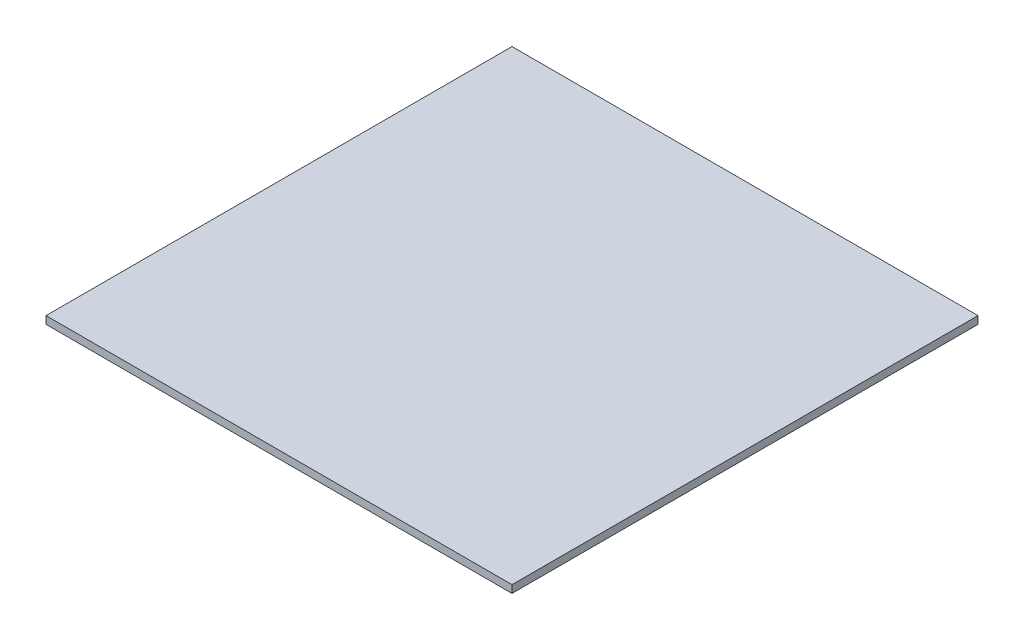
ISO-10303-21;
HEADER;
FILE_DESCRIPTION(('STEP AP214'),'2;1');
FILE_NAME('part.step','',(''),(''),'','','');
FILE_SCHEMA(('AUTOMOTIVE_DESIGN { 1 0 10303 214 1 1 1 1 }'));
ENDSEC;
DATA;
#1=APPLICATION_CONTEXT('core data for automotive mechanical design processes');
#2=APPLICATION_PROTOCOL_DEFINITION('international standard','automotive_design',2000,#1);
#3=PRODUCT_CONTEXT('',#1,'mechanical');
#4=PRODUCT('Part','Part','',(#3));
#5=PRODUCT_RELATED_PRODUCT_CATEGORY('part','',(#4));
#6=PRODUCT_DEFINITION_FORMATION('','',#4);
#7=PRODUCT_DEFINITION_CONTEXT('part definition',#1,'design');
#8=PRODUCT_DEFINITION('design','',#6,#7);
#9=PRODUCT_DEFINITION_SHAPE('','',#8);
#10=(LENGTH_UNIT() NAMED_UNIT(*) SI_UNIT(.MILLI.,.METRE.));
#11=(NAMED_UNIT(*) PLANE_ANGLE_UNIT() SI_UNIT($,.RADIAN.));
#12=(NAMED_UNIT(*) SI_UNIT($,.STERADIAN.) SOLID_ANGLE_UNIT());
#13=UNCERTAINTY_MEASURE_WITH_UNIT(LENGTH_MEASURE(1.E-05),#10,'distance_accuracy_value','');
#14=(GEOMETRIC_REPRESENTATION_CONTEXT(3) GLOBAL_UNCERTAINTY_ASSIGNED_CONTEXT((#13)) GLOBAL_UNIT_ASSIGNED_CONTEXT((#10,
#11,#12)) REPRESENTATION_CONTEXT('',''));
#15=CARTESIAN_POINT('',(0.,0.,0.));
#16=DIRECTION('',(0.,0.,1.));
#17=DIRECTION('',(1.,0.,0.));
#18=AXIS2_PLACEMENT_3D('',#15,#16,#17);
#19=CARTESIAN_POINT('',(-122.5,4.,-122.5));
#20=DIRECTION('',(1.,0.,0.));
#21=DIRECTION('',(0.,0.,-1.));
#22=AXIS2_PLACEMENT_3D('',#19,#20,#21);
#23=PLANE('',#22);
#24=DIRECTION('',(0.,0.,1.));
#25=VECTOR('',#24,1.);
#26=CARTESIAN_POINT('',(-122.5,0.,-122.5));
#27=LINE('',#26,#25);
#28=CARTESIAN_POINT('',(-122.5,0.,-122.5));
#29=VERTEX_POINT('',#28);
#30=CARTESIAN_POINT('',(-122.5,0.,122.5));
#31=VERTEX_POINT('',#30);
#32=EDGE_CURVE('E107',#29,#31,#27,.T.);
#33=ORIENTED_EDGE('',*,*,#32,.T.);
#34=DIRECTION('',(0.,-1.,0.));
#35=VECTOR('',#34,1.);
#36=CARTESIAN_POINT('',(-122.5,4.,122.5));
#37=LINE('',#36,#35);
#38=CARTESIAN_POINT('',(-122.5,4.,122.5));
#39=VERTEX_POINT('',#38);
#40=EDGE_CURVE('E11',#39,#31,#37,.T.);
#41=ORIENTED_EDGE('',*,*,#40,.F.);
#42=DIRECTION('',(0.,0.,1.));
#43=VECTOR('',#42,1.);
#44=CARTESIAN_POINT('',(-122.5,4.,-122.5));
#45=LINE('',#44,#43);
#46=CARTESIAN_POINT('',(-122.5,4.,-122.5));
#47=VERTEX_POINT('',#46);
#48=EDGE_CURVE('E91',#47,#39,#45,.T.);
#49=ORIENTED_EDGE('',*,*,#48,.F.);
#50=DIRECTION('',(0.,-1.,0.));
#51=VECTOR('',#50,1.);
#52=CARTESIAN_POINT('',(-122.5,4.,-122.5));
#53=LINE('',#52,#51);
#54=EDGE_CURVE('E103',#47,#29,#53,.T.);
#55=ORIENTED_EDGE('',*,*,#54,.T.);
#56=EDGE_LOOP('',(#33,#41,#49,#55));
#57=FACE_BOUND('',#56,.T.);
#58=ADVANCED_FACE('F39',(#57),#23,.F.);
#59=CARTESIAN_POINT('',(122.5,4.,122.5));
#60=DIRECTION('',(0.,0.,-1.));
#61=DIRECTION('',(-1.,0.,0.));
#62=AXIS2_PLACEMENT_3D('',#59,#60,#61);
#63=PLANE('',#62);
#64=DIRECTION('',(1.,0.,0.));
#65=VECTOR('',#64,1.);
#66=CARTESIAN_POINT('',(122.5,0.,122.5));
#67=LINE('',#66,#65);
#68=CARTESIAN_POINT('',(122.5,0.,122.5));
#69=VERTEX_POINT('',#68);
#70=EDGE_CURVE('E96',#31,#69,#67,.T.);
#71=ORIENTED_EDGE('',*,*,#70,.T.);
#72=DIRECTION('',(0.,-1.,0.));
#73=VECTOR('',#72,1.);
#74=CARTESIAN_POINT('',(122.5,4.,122.5));
#75=LINE('',#74,#73);
#76=CARTESIAN_POINT('',(122.5,4.,122.5));
#77=VERTEX_POINT('',#76);
#78=EDGE_CURVE('E48',#77,#69,#75,.T.);
#79=ORIENTED_EDGE('',*,*,#78,.F.);
#80=DIRECTION('',(1.,0.,0.));
#81=VECTOR('',#80,1.);
#82=CARTESIAN_POINT('',(122.5,4.,122.5));
#83=LINE('',#82,#81);
#84=EDGE_CURVE('E86',#39,#77,#83,.T.);
#85=ORIENTED_EDGE('',*,*,#84,.F.);
#86=ORIENTED_EDGE('',*,*,#40,.T.);
#87=EDGE_LOOP('',(#71,#79,#85,#86));
#88=FACE_BOUND('',#87,.T.);
#89=ADVANCED_FACE('F95',(#88),#63,.F.);
#90=CARTESIAN_POINT('',(122.5,4.,-122.5));
#91=DIRECTION('',(-1.,0.,0.));
#92=DIRECTION('',(0.,0.,1.));
#93=AXIS2_PLACEMENT_3D('',#90,#91,#92);
#94=PLANE('',#93);
#95=DIRECTION('',(0.,0.,-1.));
#96=VECTOR('',#95,1.);
#97=CARTESIAN_POINT('',(122.5,0.,-122.5));
#98=LINE('',#97,#96);
#99=CARTESIAN_POINT('',(122.5,0.,-122.5));
#100=VERTEX_POINT('',#99);
#101=EDGE_CURVE('E73',#69,#100,#98,.T.);
#102=ORIENTED_EDGE('',*,*,#101,.T.);
#103=DIRECTION('',(0.,-1.,0.));
#104=VECTOR('',#103,1.);
#105=CARTESIAN_POINT('',(122.5,4.,-122.5));
#106=LINE('',#105,#104);
#107=CARTESIAN_POINT('',(122.5,4.,-122.5));
#108=VERTEX_POINT('',#107);
#109=EDGE_CURVE('E98',#108,#100,#106,.T.);
#110=ORIENTED_EDGE('',*,*,#109,.F.);
#111=DIRECTION('',(0.,0.,-1.));
#112=VECTOR('',#111,1.);
#113=CARTESIAN_POINT('',(122.5,4.,-122.5));
#114=LINE('',#113,#112);
#115=EDGE_CURVE('E89',#77,#108,#114,.T.);
#116=ORIENTED_EDGE('',*,*,#115,.F.);
#117=ORIENTED_EDGE('',*,*,#78,.T.);
#118=EDGE_LOOP('',(#102,#110,#116,#117));
#119=FACE_BOUND('',#118,.T.);
#120=ADVANCED_FACE('F99',(#119),#94,.F.);
#121=CARTESIAN_POINT('',(122.5,4.,-122.5));
#122=DIRECTION('',(0.,0.,1.));
#123=DIRECTION('',(1.,0.,0.));
#124=AXIS2_PLACEMENT_3D('',#121,#122,#123);
#125=PLANE('',#124);
#126=DIRECTION('',(-1.,0.,0.));
#127=VECTOR('',#126,1.);
#128=CARTESIAN_POINT('',(122.5,0.,-122.5));
#129=LINE('',#128,#127);
#130=EDGE_CURVE('E79',#100,#29,#129,.T.);
#131=ORIENTED_EDGE('',*,*,#130,.T.);
#132=ORIENTED_EDGE('',*,*,#54,.F.);
#133=DIRECTION('',(-1.,0.,0.));
#134=VECTOR('',#133,1.);
#135=CARTESIAN_POINT('',(122.5,4.,-122.5));
#136=LINE('',#135,#134);
#137=EDGE_CURVE('E56',#108,#47,#136,.T.);
#138=ORIENTED_EDGE('',*,*,#137,.F.);
#139=ORIENTED_EDGE('',*,*,#109,.T.);
#140=EDGE_LOOP('',(#131,#132,#138,#139));
#141=FACE_BOUND('',#140,.T.);
#142=ADVANCED_FACE('F120',(#141),#125,.F.);
#143=CARTESIAN_POINT('',(0.,4.,0.));
#144=DIRECTION('',(0.,-1.,0.));
#145=DIRECTION('',(0.,0.,-1.));
#146=AXIS2_PLACEMENT_3D('',#143,#144,#145);
#147=PLANE('',#146);
#148=ORIENTED_EDGE('',*,*,#48,.T.);
#149=ORIENTED_EDGE('',*,*,#84,.T.);
#150=ORIENTED_EDGE('',*,*,#115,.T.);
#151=ORIENTED_EDGE('',*,*,#137,.T.);
#152=EDGE_LOOP('',(#148,#149,#150,#151));
#153=FACE_BOUND('',#152,.T.);
#154=ADVANCED_FACE('F87',(#153),#147,.F.);
#155=CARTESIAN_POINT('',(0.,0.,0.));
#156=DIRECTION('',(0.,-1.,0.));
#157=DIRECTION('',(0.,0.,-1.));
#158=AXIS2_PLACEMENT_3D('',#155,#156,#157);
#159=PLANE('',#158);
#160=ORIENTED_EDGE('',*,*,#32,.F.);
#161=ORIENTED_EDGE('',*,*,#130,.F.);
#162=ORIENTED_EDGE('',*,*,#101,.F.);
#163=ORIENTED_EDGE('',*,*,#70,.F.);
#164=EDGE_LOOP('',(#160,#161,#162,#163));
#165=FACE_BOUND('',#164,.T.);
#166=ADVANCED_FACE('F123',(#165),#159,.T.);
#167=CLOSED_SHELL('',(#58,#89,#120,#142,#154,#166));
#168=MANIFOLD_SOLID_BREP('B2',#167);
#169=ADVANCED_BREP_SHAPE_REPRESENTATION('',(#18,#168),#14);
#170=SHAPE_DEFINITION_REPRESENTATION(#9,#169);
ENDSEC;
END-ISO-10303-21;
